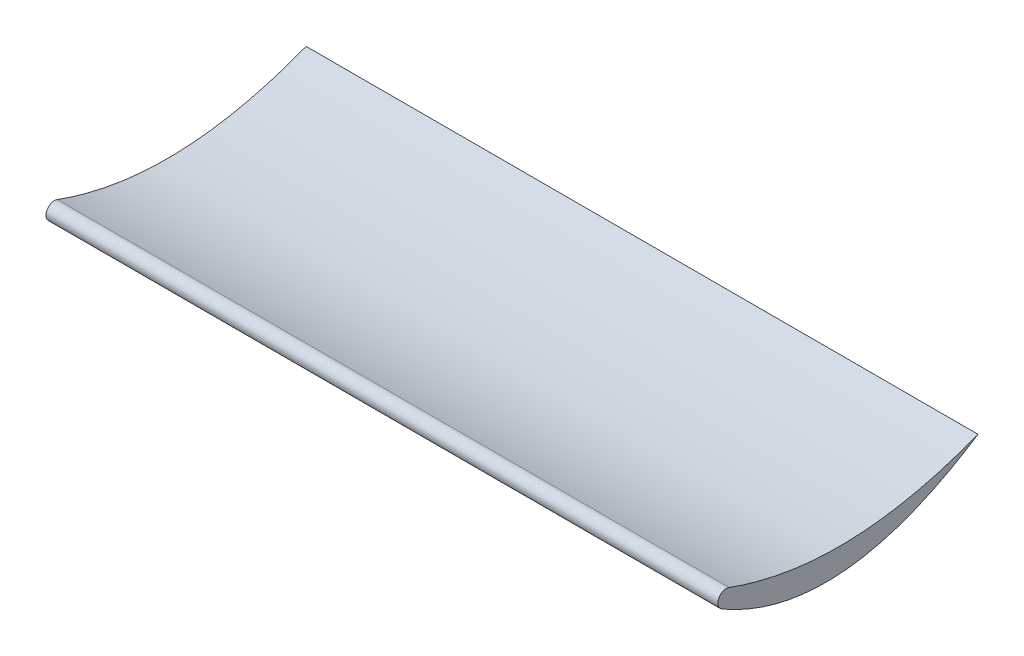
ISO-10303-21;
HEADER;
FILE_DESCRIPTION(('STEP AP214'),'2;1');
FILE_NAME('part.step','',(''),(''),'','','');
FILE_SCHEMA(('AUTOMOTIVE_DESIGN { 1 0 10303 214 1 1 1 1 }'));
ENDSEC;
DATA;
#1=APPLICATION_CONTEXT('core data for automotive mechanical design processes');
#2=APPLICATION_PROTOCOL_DEFINITION('international standard','automotive_design',2000,#1);
#3=PRODUCT_CONTEXT('',#1,'mechanical');
#4=PRODUCT('Part','Part','',(#3));
#5=PRODUCT_RELATED_PRODUCT_CATEGORY('part','',(#4));
#6=PRODUCT_DEFINITION_FORMATION('','',#4);
#7=PRODUCT_DEFINITION_CONTEXT('part definition',#1,'design');
#8=PRODUCT_DEFINITION('design','',#6,#7);
#9=PRODUCT_DEFINITION_SHAPE('','',#8);
#10=(LENGTH_UNIT() NAMED_UNIT(*) SI_UNIT(.MILLI.,.METRE.));
#11=(NAMED_UNIT(*) PLANE_ANGLE_UNIT() SI_UNIT($,.RADIAN.));
#12=(NAMED_UNIT(*) SI_UNIT($,.STERADIAN.) SOLID_ANGLE_UNIT());
#13=UNCERTAINTY_MEASURE_WITH_UNIT(LENGTH_MEASURE(1.E-05),#10,'distance_accuracy_value','');
#14=(GEOMETRIC_REPRESENTATION_CONTEXT(3) GLOBAL_UNCERTAINTY_ASSIGNED_CONTEXT((#13)) GLOBAL_UNIT_ASSIGNED_CONTEXT((#10,
#11,#12)) REPRESENTATION_CONTEXT('',''));
#15=CARTESIAN_POINT('',(0.,0.,0.));
#16=DIRECTION('',(0.,0.,1.));
#17=DIRECTION('',(1.,0.,0.));
#18=AXIS2_PLACEMENT_3D('',#15,#16,#17);
#19=CARTESIAN_POINT('',(1016.,20.0403200881925,-257.674011593724));
#20=CARTESIAN_POINT('',(1016.,-81.7596796804724,4.2626801098307));
#21=CARTESIAN_POINT('',(1016.,62.6242024949533,228.088354749672));
#22=B_SPLINE_CURVE_WITH_KNOTS('',2,(#19,#20,#21),.UNSPECIFIED.,.F.,.F.,(3,3),(0.,1.),.UNSPECIFIED.);
#23=DIRECTION('',(-1.,0.,0.));
#24=VECTOR('',#23,1.);
#25=SURFACE_OF_LINEAR_EXTRUSION('',#22,#24);
#26=CARTESIAN_POINT('',(0.,20.0403200881925,-257.674011593724));
#27=CARTESIAN_POINT('',(0.,-81.7596796804724,4.2626801098307));
#28=CARTESIAN_POINT('',(0.,62.6242024949533,228.088354749672));
#29=B_SPLINE_CURVE_WITH_KNOTS('',2,(#26,#27,#28),.UNSPECIFIED.,.F.,.F.,(3,3),(0.,1.),.UNSPECIFIED.);
#30=CARTESIAN_POINT('',(0.,20.0403200881925,-257.674011593724));
#31=VERTEX_POINT('',#30);
#32=CARTESIAN_POINT('',(0.,7.57017387186558,118.648020106902));
#33=VERTEX_POINT('',#32);
#34=EDGE_CURVE('E85',#31,#33,#29,.T.);
#35=ORIENTED_EDGE('',*,*,#34,.T.);
#36=DIRECTION('',(-1.,0.,0.));
#37=VECTOR('',#36,1.);
#38=CARTESIAN_POINT('',(0.,7.57017387186557,118.648020106902));
#39=LINE('',#38,#37);
#40=CARTESIAN_POINT('',(1016.,7.57017387186558,118.648020106902));
#41=VERTEX_POINT('',#40);
#42=EDGE_CURVE('E43',#33,#41,#39,.F.);
#43=ORIENTED_EDGE('',*,*,#42,.T.);
#44=CARTESIAN_POINT('',(1016.,20.0403200881925,-257.674011593724));
#45=VERTEX_POINT('',#44);
#46=EDGE_CURVE('E72',#45,#41,#22,.T.);
#47=ORIENTED_EDGE('',*,*,#46,.F.);
#48=DIRECTION('',(-1.,0.,0.));
#49=VECTOR('',#48,1.);
#50=CARTESIAN_POINT('',(1016.,20.0403200881925,-257.674011593724));
#51=LINE('',#50,#49);
#52=EDGE_CURVE('E77',#45,#31,#51,.T.);
#53=ORIENTED_EDGE('',*,*,#52,.T.);
#54=EDGE_LOOP('',(#35,#43,#47,#53));
#55=FACE_BOUND('',#54,.T.);
#56=ADVANCED_FACE('F35',(#55),#25,.F.);
#57=CARTESIAN_POINT('',(1016.,62.6242024949533,228.088354749672));
#58=CARTESIAN_POINT('',(1016.,-156.977534248854,11.7118246145431));
#59=CARTESIAN_POINT('',(1016.,20.0403200881925,-257.674011593724));
#60=B_SPLINE_CURVE_WITH_KNOTS('',2,(#57,#58,#59),.UNSPECIFIED.,.F.,.F.,(3,3),(0.,1.),.UNSPECIFIED.);
#61=DIRECTION('',(-1.,0.,0.));
#62=VECTOR('',#61,1.);
#63=SURFACE_OF_LINEAR_EXTRUSION('',#60,#62);
#64=CARTESIAN_POINT('',(1016.,-15.3566801179117,129.361802362037));
#65=VERTEX_POINT('',#64);
#66=EDGE_CURVE('E69',#65,#45,#60,.T.);
#67=ORIENTED_EDGE('',*,*,#66,.F.);
#68=DIRECTION('',(-1.,0.,0.));
#69=VECTOR('',#68,1.);
#70=CARTESIAN_POINT('',(1016.,-15.3566801179117,129.361802362037));
#71=LINE('',#70,#69);
#72=CARTESIAN_POINT('',(0.,-15.3566801179117,129.361802362037));
#73=VERTEX_POINT('',#72);
#74=EDGE_CURVE('E82',#65,#73,#71,.T.);
#75=ORIENTED_EDGE('',*,*,#74,.T.);
#76=CARTESIAN_POINT('',(0.,62.6242024949533,228.088354749672));
#77=CARTESIAN_POINT('',(0.,-156.977534248854,11.7118246145431));
#78=CARTESIAN_POINT('',(0.,20.0403200881925,-257.674011593724));
#79=B_SPLINE_CURVE_WITH_KNOTS('',2,(#76,#77,#78),.UNSPECIFIED.,.F.,.F.,(3,3),(0.,1.),.UNSPECIFIED.);
#80=EDGE_CURVE('E81',#73,#31,#79,.T.);
#81=ORIENTED_EDGE('',*,*,#80,.T.);
#82=ORIENTED_EDGE('',*,*,#52,.F.);
#83=EDGE_LOOP('',(#67,#75,#81,#82));
#84=FACE_BOUND('',#83,.T.);
#85=ADVANCED_FACE('F80',(#84),#63,.F.);
#86=CARTESIAN_POINT('',(1016.,-20.2137091944498,-5.26507415609766));
#87=DIRECTION('',(-1.,0.,0.));
#88=DIRECTION('',(0.,0.,1.));
#89=AXIS2_PLACEMENT_3D('',#86,#87,#88);
#90=PLANE('',#89);
#91=ORIENTED_EDGE('',*,*,#46,.T.);
#92=CARTESIAN_POINT('',(1016.,-4.35383131494388,123.019301418479));
#93=DIRECTION('',(-1.,0.,0.));
#94=DIRECTION('',(0.,0.,1.));
#95=AXIS2_PLACEMENT_3D('',#92,#93,#94);
#96=CIRCLE('',#95,12.7);
#97=EDGE_CURVE('E11',#41,#65,#96,.F.);
#98=ORIENTED_EDGE('',*,*,#97,.T.);
#99=ORIENTED_EDGE('',*,*,#66,.T.);
#100=EDGE_LOOP('',(#91,#98,#99));
#101=FACE_BOUND('',#100,.T.);
#102=ADVANCED_FACE('F71',(#101),#90,.F.);
#103=CARTESIAN_POINT('',(0.,-20.2137091944498,-5.26507415609766));
#104=DIRECTION('',(-1.,0.,0.));
#105=DIRECTION('',(0.,0.,1.));
#106=AXIS2_PLACEMENT_3D('',#103,#104,#105);
#107=PLANE('',#106);
#108=ORIENTED_EDGE('',*,*,#80,.F.);
#109=CARTESIAN_POINT('',(0.,-4.35383131494388,123.019301418479));
#110=DIRECTION('',(-1.,0.,0.));
#111=DIRECTION('',(0.,0.,1.));
#112=AXIS2_PLACEMENT_3D('',#109,#110,#111);
#113=CIRCLE('',#112,12.7);
#114=EDGE_CURVE('E57',#73,#33,#113,.T.);
#115=ORIENTED_EDGE('',*,*,#114,.T.);
#116=ORIENTED_EDGE('',*,*,#34,.F.);
#117=EDGE_LOOP('',(#108,#115,#116));
#118=FACE_BOUND('',#117,.T.);
#119=ADVANCED_FACE('F101',(#118),#107,.T.);
#120=CARTESIAN_POINT('',(508.,-4.35383131494388,123.019301418479));
#121=DIRECTION('',(-1.,0.,0.));
#122=DIRECTION('',(0.,0.,1.));
#123=AXIS2_PLACEMENT_3D('',#120,#121,#122);
#124=CYLINDRICAL_SURFACE('',#123,12.7);
#125=ORIENTED_EDGE('',*,*,#97,.F.);
#126=ORIENTED_EDGE('',*,*,#42,.F.);
#127=ORIENTED_EDGE('',*,*,#114,.F.);
#128=ORIENTED_EDGE('',*,*,#74,.F.);
#129=EDGE_LOOP('',(#125,#126,#127,#128));
#130=FACE_BOUND('',#129,.T.);
#131=ADVANCED_FACE('F37',(#130),#124,.T.);
#132=CLOSED_SHELL('',(#56,#85,#102,#119,#131));
#133=MANIFOLD_SOLID_BREP('B2',#132);
#134=ADVANCED_BREP_SHAPE_REPRESENTATION('',(#18,#133),#14);
#135=SHAPE_DEFINITION_REPRESENTATION(#9,#134);
ENDSEC;
END-ISO-10303-21;
